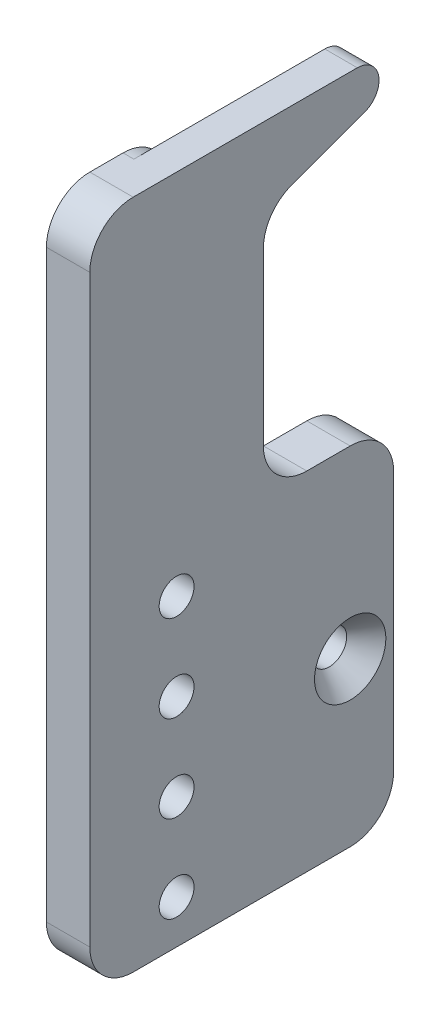
ISO-10303-21;
HEADER;
FILE_DESCRIPTION(('STEP AP214'),'2;1');
FILE_NAME('part.step','',(''),(''),'','','');
FILE_SCHEMA(('AUTOMOTIVE_DESIGN { 1 0 10303 214 1 1 1 1 }'));
ENDSEC;
DATA;
#1=APPLICATION_CONTEXT('core data for automotive mechanical design processes');
#2=APPLICATION_PROTOCOL_DEFINITION('international standard','automotive_design',2000,#1);
#3=PRODUCT_CONTEXT('',#1,'mechanical');
#4=PRODUCT('Part','Part','',(#3));
#5=PRODUCT_RELATED_PRODUCT_CATEGORY('part','',(#4));
#6=PRODUCT_DEFINITION_FORMATION('','',#4);
#7=PRODUCT_DEFINITION_CONTEXT('part definition',#1,'design');
#8=PRODUCT_DEFINITION('design','',#6,#7);
#9=PRODUCT_DEFINITION_SHAPE('','',#8);
#10=(LENGTH_UNIT() NAMED_UNIT(*) SI_UNIT(.MILLI.,.METRE.));
#11=(NAMED_UNIT(*) PLANE_ANGLE_UNIT() SI_UNIT($,.RADIAN.));
#12=(NAMED_UNIT(*) SI_UNIT($,.STERADIAN.) SOLID_ANGLE_UNIT());
#13=UNCERTAINTY_MEASURE_WITH_UNIT(LENGTH_MEASURE(1.E-05),#10,'distance_accuracy_value','');
#14=(GEOMETRIC_REPRESENTATION_CONTEXT(3) GLOBAL_UNCERTAINTY_ASSIGNED_CONTEXT((#13)) GLOBAL_UNIT_ASSIGNED_CONTEXT((#10,
#11,#12)) REPRESENTATION_CONTEXT('',''));
#15=CARTESIAN_POINT('',(0.,0.,0.));
#16=DIRECTION('',(0.,0.,1.));
#17=DIRECTION('',(1.,0.,0.));
#18=AXIS2_PLACEMENT_3D('',#15,#16,#17);
#19=CARTESIAN_POINT('',(335.75625,2.44620492239523,723.9));
#20=DIRECTION('',(-1.,0.,0.));
#21=DIRECTION('',(0.,-1.,0.));
#22=AXIS2_PLACEMENT_3D('',#19,#20,#21);
#23=CYLINDRICAL_SURFACE('',#22,2.5527);
#24=CARTESIAN_POINT('',(329.40625,2.44620492239523,723.9));
#25=DIRECTION('',(1.,0.,0.));
#26=DIRECTION('',(0.,1.,0.));
#27=AXIS2_PLACEMENT_3D('',#24,#25,#26);
#28=CIRCLE('',#27,2.5527);
#29=CARTESIAN_POINT('',(329.40625,4.99890492239524,723.9));
#30=VERTEX_POINT('',#29);
#31=EDGE_CURVE('E275',#30,#30,#28,.T.);
#32=ORIENTED_EDGE('',*,*,#31,.F.);
#33=EDGE_LOOP('',(#32));
#34=FACE_BOUND('',#33,.T.);
#35=CARTESIAN_POINT('',(332.688217457942,2.44620492239523,723.9));
#36=DIRECTION('',(1.,0.,0.));
#37=DIRECTION('',(0.,1.,0.));
#38=AXIS2_PLACEMENT_3D('',#35,#36,#37);
#39=CIRCLE('',#38,2.5527);
#40=CARTESIAN_POINT('',(332.688217457942,4.99890492239524,723.9));
#41=VERTEX_POINT('',#40);
#42=EDGE_CURVE('E567',#41,#41,#39,.T.);
#43=ORIENTED_EDGE('',*,*,#42,.T.);
#44=EDGE_LOOP('',(#43));
#45=FACE_BOUND('',#44,.T.);
#46=ADVANCED_FACE('F17',(#34,#45),#23,.F.);
#47=CARTESIAN_POINT('',(329.40625,-123.508232409556,552.45));
#48=DIRECTION('',(1.,0.,0.));
#49=DIRECTION('',(0.,1.,0.));
#50=AXIS2_PLACEMENT_3D('',#47,#48,#49);
#51=PLANE('',#50);
#52=CARTESIAN_POINT('',(329.40625,-15.0162950776049,749.3));
#53=DIRECTION('',(1.,0.,0.));
#54=DIRECTION('',(0.,1.,0.));
#55=AXIS2_PLACEMENT_3D('',#52,#53,#54);
#56=CIRCLE('',#55,2.5527);
#57=CARTESIAN_POINT('',(329.40625,-12.4635950776049,749.3));
#58=VERTEX_POINT('',#57);
#59=EDGE_CURVE('E286',#58,#58,#56,.T.);
#60=ORIENTED_EDGE('',*,*,#59,.T.);
#61=EDGE_LOOP('',(#60));
#62=FACE_BOUND('',#61,.T.);
#63=CARTESIAN_POINT('',(329.40625,-2.31629507760492,749.3));
#64=DIRECTION('',(1.,0.,0.));
#65=DIRECTION('',(0.,1.,0.));
#66=AXIS2_PLACEMENT_3D('',#63,#64,#65);
#67=CIRCLE('',#66,2.5527);
#68=CARTESIAN_POINT('',(329.40625,0.236404922395075,749.3));
#69=VERTEX_POINT('',#68);
#70=EDGE_CURVE('E284',#69,#69,#67,.T.);
#71=ORIENTED_EDGE('',*,*,#70,.T.);
#72=EDGE_LOOP('',(#71));
#73=FACE_BOUND('',#72,.T.);
#74=CARTESIAN_POINT('',(329.40625,10.3837049223951,749.3));
#75=DIRECTION('',(1.,0.,0.));
#76=DIRECTION('',(0.,1.,0.));
#77=AXIS2_PLACEMENT_3D('',#74,#75,#76);
#78=CIRCLE('',#77,2.5527);
#79=CARTESIAN_POINT('',(329.40625,12.9364049223951,749.3));
#80=VERTEX_POINT('',#79);
#81=EDGE_CURVE('E281',#80,#80,#78,.T.);
#82=ORIENTED_EDGE('',*,*,#81,.T.);
#83=EDGE_LOOP('',(#82));
#84=FACE_BOUND('',#83,.T.);
#85=CARTESIAN_POINT('',(329.40625,23.0837049223951,749.3));
#86=DIRECTION('',(1.,0.,0.));
#87=DIRECTION('',(0.,1.,0.));
#88=AXIS2_PLACEMENT_3D('',#85,#86,#87);
#89=CIRCLE('',#88,2.5527);
#90=CARTESIAN_POINT('',(329.40625,25.6364049223951,749.3));
#91=VERTEX_POINT('',#90);
#92=EDGE_CURVE('E278',#91,#91,#89,.T.);
#93=ORIENTED_EDGE('',*,*,#92,.T.);
#94=EDGE_LOOP('',(#93));
#95=FACE_BOUND('',#94,.T.);
#96=ORIENTED_EDGE('',*,*,#31,.T.);
#97=EDGE_LOOP('',(#96));
#98=FACE_BOUND('',#97,.T.);
#99=DIRECTION('',(0.,0.707106781186548,0.707106781186548));
#100=VECTOR('',#99,1.);
#101=CARTESIAN_POINT('',(329.40625,71.0555077119113,742.378027468976));
#102=LINE('',#101,#100);
#103=CARTESIAN_POINT('',(329.40625,67.1373521824006,738.459871939466));
#104=VERTEX_POINT('',#103);
#105=CARTESIAN_POINT('',(329.40625,74.9736632414219,746.296182998487));
#106=VERTEX_POINT('',#105);
#107=EDGE_CURVE('E156',#104,#106,#102,.T.);
#108=ORIENTED_EDGE('',*,*,#107,.F.);
#109=CARTESIAN_POINT('',(329.40625,62.6472241218661,742.95));
#110=DIRECTION('',(1.,0.,0.));
#111=DIRECTION('',(0.,1.,0.));
#112=AXIS2_PLACEMENT_3D('',#109,#110,#111);
#113=CIRCLE('',#112,6.35);
#114=CARTESIAN_POINT('',(329.40625,62.6472241218661,736.6));
#115=VERTEX_POINT('',#114);
#116=EDGE_CURVE('E238',#104,#115,#113,.F.);
#117=ORIENTED_EDGE('',*,*,#116,.T.);
#118=DIRECTION('',(0.,1.,0.));
#119=VECTOR('',#118,1.);
#120=CARTESIAN_POINT('',(329.40625,47.3555925826652,736.6));
#121=LINE('',#120,#119);
#122=CARTESIAN_POINT('',(329.40625,35.7837049223951,736.6));
#123=VERTEX_POINT('',#122);
#124=EDGE_CURVE('E258',#123,#115,#121,.T.);
#125=ORIENTED_EDGE('',*,*,#124,.F.);
#126=CARTESIAN_POINT('',(329.40625,35.7837049223951,730.25));
#127=DIRECTION('',(1.,0.,0.));
#128=DIRECTION('',(0.,1.,0.));
#129=AXIS2_PLACEMENT_3D('',#126,#127,#128);
#130=CIRCLE('',#129,6.35);
#131=CARTESIAN_POINT('',(329.40625,29.4337049223951,730.25));
#132=VERTEX_POINT('',#131);
#133=EDGE_CURVE('E199',#123,#132,#130,.T.);
#134=ORIENTED_EDGE('',*,*,#133,.T.);
#135=DIRECTION('',(0.,0.,-1.));
#136=VECTOR('',#135,1.);
#137=CARTESIAN_POINT('',(329.40625,29.4337049223951,552.45));
#138=LINE('',#137,#136);
#139=CARTESIAN_POINT('',(329.40625,29.4337049223951,723.9));
#140=VERTEX_POINT('',#139);
#141=EDGE_CURVE('E269',#132,#140,#138,.T.);
#142=ORIENTED_EDGE('',*,*,#141,.T.);
#143=CARTESIAN_POINT('',(329.40625,23.0837049223951,723.9));
#144=DIRECTION('',(1.,0.,0.));
#145=DIRECTION('',(0.,1.,0.));
#146=AXIS2_PLACEMENT_3D('',#143,#144,#145);
#147=CIRCLE('',#146,6.35);
#148=CARTESIAN_POINT('',(329.40625,23.0837049223951,717.55));
#149=VERTEX_POINT('',#148);
#150=EDGE_CURVE('E225',#140,#149,#147,.F.);
#151=ORIENTED_EDGE('',*,*,#150,.T.);
#152=DIRECTION('',(0.,-1.,0.));
#153=VECTOR('',#152,1.);
#154=CARTESIAN_POINT('',(329.40625,4.03370492239507,717.55));
#155=LINE('',#154,#153);
#156=CARTESIAN_POINT('',(329.40625,-15.0162950776049,717.55));
#157=VERTEX_POINT('',#156);
#158=EDGE_CURVE('E264',#149,#157,#155,.T.);
#159=ORIENTED_EDGE('',*,*,#158,.T.);
#160=CARTESIAN_POINT('',(329.40625,-15.0162950776049,723.9));
#161=DIRECTION('',(1.,0.,0.));
#162=DIRECTION('',(0.,1.,0.));
#163=AXIS2_PLACEMENT_3D('',#160,#161,#162);
#164=CIRCLE('',#163,6.35);
#165=CARTESIAN_POINT('',(329.40625,-21.3662950776049,723.9));
#166=VERTEX_POINT('',#165);
#167=EDGE_CURVE('E215',#157,#166,#164,.F.);
#168=ORIENTED_EDGE('',*,*,#167,.T.);
#169=DIRECTION('',(0.,0.,-1.));
#170=VECTOR('',#169,1.);
#171=CARTESIAN_POINT('',(329.40625,-21.3662950776049,739.775));
#172=LINE('',#171,#170);
#173=CARTESIAN_POINT('',(329.40625,-21.3662950776049,755.65));
#174=VERTEX_POINT('',#173);
#175=EDGE_CURVE('E272',#174,#166,#172,.T.);
#176=ORIENTED_EDGE('',*,*,#175,.F.);
#177=CARTESIAN_POINT('',(329.40625,-15.0162950776049,755.65));
#178=DIRECTION('',(1.,0.,0.));
#179=DIRECTION('',(0.,1.,0.));
#180=AXIS2_PLACEMENT_3D('',#177,#178,#179);
#181=CIRCLE('',#180,6.35);
#182=CARTESIAN_POINT('',(329.40625,-15.0162950776049,762.));
#183=VERTEX_POINT('',#182);
#184=EDGE_CURVE('E206',#174,#183,#181,.F.);
#185=ORIENTED_EDGE('',*,*,#184,.T.);
#186=DIRECTION('',(0.,-1.,0.));
#187=VECTOR('',#186,1.);
#188=CARTESIAN_POINT('',(329.40625,4.03370492239506,762.));
#189=LINE('',#188,#187);
#190=CARTESIAN_POINT('',(329.40625,70.4835351808873,762.));
#191=VERTEX_POINT('',#190);
#192=EDGE_CURVE('E163',#191,#183,#189,.T.);
#193=ORIENTED_EDGE('',*,*,#192,.F.);
#194=CARTESIAN_POINT('',(329.40625,70.4835351808873,755.65));
#195=DIRECTION('',(1.,0.,0.));
#196=DIRECTION('',(0.,1.,0.));
#197=AXIS2_PLACEMENT_3D('',#194,#195,#196);
#198=CIRCLE('',#197,6.35);
#199=CARTESIAN_POINT('',(329.40625,76.8335351808873,755.65));
#200=VERTEX_POINT('',#199);
#201=EDGE_CURVE('E187',#191,#200,#198,.F.);
#202=ORIENTED_EDGE('',*,*,#201,.T.);
#203=DIRECTION('',(0.,0.,1.));
#204=VECTOR('',#203,1.);
#205=CARTESIAN_POINT('',(329.40625,76.8335351808873,733.425));
#206=LINE('',#205,#204);
#207=CARTESIAN_POINT('',(329.40625,76.8335351808873,750.786311059021));
#208=VERTEX_POINT('',#207);
#209=EDGE_CURVE('E262',#208,#200,#206,.T.);
#210=ORIENTED_EDGE('',*,*,#209,.F.);
#211=CARTESIAN_POINT('',(329.40625,70.4835351808873,750.786311059021));
#212=DIRECTION('',(1.,0.,0.));
#213=DIRECTION('',(0.,1.,0.));
#214=AXIS2_PLACEMENT_3D('',#211,#212,#213);
#215=CIRCLE('',#214,6.35);
#216=EDGE_CURVE('E236',#208,#106,#215,.F.);
#217=ORIENTED_EDGE('',*,*,#216,.T.);
#218=EDGE_LOOP('',(#108,#117,#125,#134,#142,#151,#159,#168,#176,#185,#193,#202,#210,#217));
#219=FACE_BOUND('',#218,.T.);
#220=ADVANCED_FACE('F257',(#62,#73,#84,#95,#98,#219),#51,.F.);
#221=CARTESIAN_POINT('',(335.75625,76.8335351808873,733.425));
#222=DIRECTION('',(0.,-1.,0.));
#223=DIRECTION('',(1.,0.,0.));
#224=AXIS2_PLACEMENT_3D('',#221,#222,#223);
#225=PLANE('',#224);
#226=DIRECTION('',(0.,0.,1.));
#227=VECTOR('',#226,1.);
#228=CARTESIAN_POINT('',(330.99375,76.8335351808873,733.425));
#229=LINE('',#228,#227);
#230=CARTESIAN_POINT('',(330.99375,76.8335351808873,722.856319777287));
#231=VERTEX_POINT('',#230);
#232=CARTESIAN_POINT('',(330.99375,76.8335351808873,750.786311059021));
#233=VERTEX_POINT('',#232);
#234=EDGE_CURVE('E32',#231,#233,#229,.T.);
#235=ORIENTED_EDGE('',*,*,#234,.T.);
#236=DIRECTION('',(-1.,0.,0.));
#237=VECTOR('',#236,1.);
#238=CARTESIAN_POINT('',(335.75625,76.8335351808873,750.786311059021));
#239=LINE('',#238,#237);
#240=EDGE_CURVE('E241',#233,#208,#239,.T.);
#241=ORIENTED_EDGE('',*,*,#240,.T.);
#242=ORIENTED_EDGE('',*,*,#209,.T.);
#243=DIRECTION('',(-1.,0.,0.));
#244=VECTOR('',#243,1.);
#245=CARTESIAN_POINT('',(335.75625,76.8335351808873,755.65));
#246=LINE('',#245,#244);
#247=CARTESIAN_POINT('',(335.75625,76.8335351808873,755.65));
#248=VERTEX_POINT('',#247);
#249=EDGE_CURVE('E190',#200,#248,#246,.F.);
#250=ORIENTED_EDGE('',*,*,#249,.T.);
#251=DIRECTION('',(0.,0.,1.));
#252=VECTOR('',#251,1.);
#253=CARTESIAN_POINT('',(335.75625,76.8335351808873,733.425));
#254=LINE('',#253,#252);
#255=CARTESIAN_POINT('',(335.75625,76.8335351808873,722.856319777287));
#256=VERTEX_POINT('',#255);
#257=EDGE_CURVE('E307',#256,#248,#254,.T.);
#258=ORIENTED_EDGE('',*,*,#257,.F.);
#259=DIRECTION('',(-1.,0.,0.));
#260=VECTOR('',#259,1.);
#261=CARTESIAN_POINT('',(335.75625,76.8335351808873,722.856319777287));
#262=LINE('',#261,#260);
#263=EDGE_CURVE('E167',#256,#231,#262,.T.);
#264=ORIENTED_EDGE('',*,*,#263,.T.);
#265=EDGE_LOOP('',(#235,#241,#242,#250,#258,#264));
#266=FACE_BOUND('',#265,.T.);
#267=ADVANCED_FACE('F348',(#266),#225,.F.);
#268=CARTESIAN_POINT('',(335.75625,4.03370492239506,762.));
#269=DIRECTION('',(0.,0.,-1.));
#270=DIRECTION('',(-1.,0.,0.));
#271=AXIS2_PLACEMENT_3D('',#268,#269,#270);
#272=PLANE('',#271);
#273=ORIENTED_EDGE('',*,*,#192,.T.);
#274=DIRECTION('',(-1.,0.,0.));
#275=VECTOR('',#274,1.);
#276=CARTESIAN_POINT('',(335.75625,-15.0162950776049,762.));
#277=LINE('',#276,#275);
#278=CARTESIAN_POINT('',(335.75625,-15.0162950776049,762.));
#279=VERTEX_POINT('',#278);
#280=EDGE_CURVE('E208',#183,#279,#277,.F.);
#281=ORIENTED_EDGE('',*,*,#280,.T.);
#282=DIRECTION('',(0.,-1.,0.));
#283=VECTOR('',#282,1.);
#284=CARTESIAN_POINT('',(335.75625,4.03370492239506,762.));
#285=LINE('',#284,#283);
#286=CARTESIAN_POINT('',(335.75625,70.4835351808873,762.));
#287=VERTEX_POINT('',#286);
#288=EDGE_CURVE('E288',#287,#279,#285,.T.);
#289=ORIENTED_EDGE('',*,*,#288,.F.);
#290=DIRECTION('',(-1.,0.,0.));
#291=VECTOR('',#290,1.);
#292=CARTESIAN_POINT('',(335.75625,70.4835351808873,762.));
#293=LINE('',#292,#291);
#294=EDGE_CURVE('E184',#287,#191,#293,.T.);
#295=ORIENTED_EDGE('',*,*,#294,.T.);
#296=EDGE_LOOP('',(#273,#281,#289,#295));
#297=FACE_BOUND('',#296,.T.);
#298=ADVANCED_FACE('F359',(#297),#272,.F.);
#299=CARTESIAN_POINT('',(335.75625,-21.3662950776049,739.775));
#300=DIRECTION('',(0.,1.,0.));
#301=DIRECTION('',(0.,0.,1.));
#302=AXIS2_PLACEMENT_3D('',#299,#300,#301);
#303=PLANE('',#302);
#304=ORIENTED_EDGE('',*,*,#175,.T.);
#305=DIRECTION('',(-1.,0.,0.));
#306=VECTOR('',#305,1.);
#307=CARTESIAN_POINT('',(335.75625,-21.3662950776049,723.9));
#308=LINE('',#307,#306);
#309=CARTESIAN_POINT('',(335.75625,-21.3662950776049,723.9));
#310=VERTEX_POINT('',#309);
#311=EDGE_CURVE('E217',#166,#310,#308,.F.);
#312=ORIENTED_EDGE('',*,*,#311,.T.);
#313=DIRECTION('',(0.,0.,-1.));
#314=VECTOR('',#313,1.);
#315=CARTESIAN_POINT('',(335.75625,-21.3662950776049,739.775));
#316=LINE('',#315,#314);
#317=CARTESIAN_POINT('',(335.75625,-21.3662950776049,755.65));
#318=VERTEX_POINT('',#317);
#319=EDGE_CURVE('E303',#318,#310,#316,.T.);
#320=ORIENTED_EDGE('',*,*,#319,.F.);
#321=DIRECTION('',(-1.,0.,0.));
#322=VECTOR('',#321,1.);
#323=CARTESIAN_POINT('',(335.75625,-21.3662950776049,755.65));
#324=LINE('',#323,#322);
#325=EDGE_CURVE('E203',#318,#174,#324,.T.);
#326=ORIENTED_EDGE('',*,*,#325,.T.);
#327=EDGE_LOOP('',(#304,#312,#320,#326));
#328=FACE_BOUND('',#327,.T.);
#329=ADVANCED_FACE('F355',(#328),#303,.F.);
#330=CARTESIAN_POINT('',(335.75625,4.03370492239507,717.55));
#331=DIRECTION('',(0.,0.,-1.));
#332=DIRECTION('',(-1.,0.,0.));
#333=AXIS2_PLACEMENT_3D('',#330,#331,#332);
#334=PLANE('',#333);
#335=ORIENTED_EDGE('',*,*,#158,.F.);
#336=DIRECTION('',(-1.,0.,0.));
#337=VECTOR('',#336,1.);
#338=CARTESIAN_POINT('',(335.75625,23.0837049223951,717.55));
#339=LINE('',#338,#337);
#340=CARTESIAN_POINT('',(335.75625,23.0837049223951,717.55));
#341=VERTEX_POINT('',#340);
#342=EDGE_CURVE('E227',#149,#341,#339,.F.);
#343=ORIENTED_EDGE('',*,*,#342,.T.);
#344=DIRECTION('',(0.,-1.,0.));
#345=VECTOR('',#344,1.);
#346=CARTESIAN_POINT('',(335.75625,4.03370492239507,717.55));
#347=LINE('',#346,#345);
#348=CARTESIAN_POINT('',(335.75625,-15.0162950776049,717.55));
#349=VERTEX_POINT('',#348);
#350=EDGE_CURVE('E304',#341,#349,#347,.T.);
#351=ORIENTED_EDGE('',*,*,#350,.T.);
#352=DIRECTION('',(-1.,0.,0.));
#353=VECTOR('',#352,1.);
#354=CARTESIAN_POINT('',(329.40625,-15.0162950776049,717.55));
#355=LINE('',#354,#353);
#356=EDGE_CURVE('E212',#349,#157,#355,.T.);
#357=ORIENTED_EDGE('',*,*,#356,.T.);
#358=EDGE_LOOP('',(#335,#343,#351,#357));
#359=FACE_BOUND('',#358,.T.);
#360=ADVANCED_FACE('F358',(#359),#334,.T.);
#361=CARTESIAN_POINT('',(335.75625,29.4337049223951,552.45));
#362=DIRECTION('',(0.,1.,0.));
#363=DIRECTION('',(-1.,0.,0.));
#364=AXIS2_PLACEMENT_3D('',#361,#362,#363);
#365=PLANE('',#364);
#366=DIRECTION('',(0.,0.,-1.));
#367=VECTOR('',#366,1.);
#368=CARTESIAN_POINT('',(335.75625,29.4337049223951,552.45));
#369=LINE('',#368,#367);
#370=CARTESIAN_POINT('',(335.75625,29.4337049223951,730.25));
#371=VERTEX_POINT('',#370);
#372=CARTESIAN_POINT('',(335.75625,29.4337049223951,723.9));
#373=VERTEX_POINT('',#372);
#374=EDGE_CURVE('E301',#371,#373,#369,.T.);
#375=ORIENTED_EDGE('',*,*,#374,.T.);
#376=DIRECTION('',(-1.,0.,0.));
#377=VECTOR('',#376,1.);
#378=CARTESIAN_POINT('',(335.75625,29.4337049223951,723.9));
#379=LINE('',#378,#377);
#380=EDGE_CURVE('E222',#373,#140,#379,.T.);
#381=ORIENTED_EDGE('',*,*,#380,.T.);
#382=ORIENTED_EDGE('',*,*,#141,.F.);
#383=DIRECTION('',(-1.,0.,0.));
#384=VECTOR('',#383,1.);
#385=CARTESIAN_POINT('',(335.75625,29.4337049223951,730.25));
#386=LINE('',#385,#384);
#387=EDGE_CURVE('E197',#132,#371,#386,.F.);
#388=ORIENTED_EDGE('',*,*,#387,.T.);
#389=EDGE_LOOP('',(#375,#381,#382,#388));
#390=FACE_BOUND('',#389,.T.);
#391=ADVANCED_FACE('F361',(#390),#365,.T.);
#392=CARTESIAN_POINT('',(335.75625,47.3555925826652,736.6));
#393=DIRECTION('',(0.,0.,1.));
#394=DIRECTION('',(1.,0.,0.));
#395=AXIS2_PLACEMENT_3D('',#392,#393,#394);
#396=PLANE('',#395);
#397=ORIENTED_EDGE('',*,*,#124,.T.);
#398=DIRECTION('',(-1.,0.,0.));
#399=VECTOR('',#398,1.);
#400=CARTESIAN_POINT('',(335.75625,62.6472241218661,736.6));
#401=LINE('',#400,#399);
#402=CARTESIAN_POINT('',(330.99375,62.6472241218661,736.6));
#403=VERTEX_POINT('',#402);
#404=EDGE_CURVE('E39',#115,#403,#401,.F.);
#405=ORIENTED_EDGE('',*,*,#404,.T.);
#406=DIRECTION('',(0.,-1.,0.));
#407=VECTOR('',#406,1.);
#408=CARTESIAN_POINT('',(330.99375,47.3555925826652,736.6));
#409=LINE('',#408,#407);
#410=CARTESIAN_POINT('',(330.99375,60.8311623753037,736.6));
#411=VERTEX_POINT('',#410);
#412=EDGE_CURVE('E178',#403,#411,#409,.T.);
#413=ORIENTED_EDGE('',*,*,#412,.T.);
#414=DIRECTION('',(-1.,0.,0.));
#415=VECTOR('',#414,1.);
#416=CARTESIAN_POINT('',(335.75625,60.8311623753037,736.6));
#417=LINE('',#416,#415);
#418=CARTESIAN_POINT('',(335.75625,60.8311623753037,736.6));
#419=VERTEX_POINT('',#418);
#420=EDGE_CURVE('E175',#411,#419,#417,.F.);
#421=ORIENTED_EDGE('',*,*,#420,.T.);
#422=DIRECTION('',(0.,1.,0.));
#423=VECTOR('',#422,1.);
#424=CARTESIAN_POINT('',(335.75625,47.3555925826652,736.6));
#425=LINE('',#424,#423);
#426=CARTESIAN_POINT('',(335.75625,35.7837049223951,736.6));
#427=VERTEX_POINT('',#426);
#428=EDGE_CURVE('E292',#427,#419,#425,.T.);
#429=ORIENTED_EDGE('',*,*,#428,.F.);
#430=DIRECTION('',(-1.,0.,0.));
#431=VECTOR('',#430,1.);
#432=CARTESIAN_POINT('',(335.75625,35.7837049223951,736.6));
#433=LINE('',#432,#431);
#434=EDGE_CURVE('E194',#427,#123,#433,.T.);
#435=ORIENTED_EDGE('',*,*,#434,.T.);
#436=EDGE_LOOP('',(#397,#405,#413,#421,#429,#435));
#437=FACE_BOUND('',#436,.T.);
#438=ADVANCED_FACE('F259',(#437),#396,.F.);
#439=CARTESIAN_POINT('',(335.75625,-2.31629507760493,749.3));
#440=DIRECTION('',(-1.,0.,0.));
#441=DIRECTION('',(0.,-1.,0.));
#442=AXIS2_PLACEMENT_3D('',#439,#440,#441);
#443=CYLINDRICAL_SURFACE('',#442,2.5527);
#444=CARTESIAN_POINT('',(335.75625,-2.31629507760493,749.3));
#445=DIRECTION('',(1.,0.,0.));
#446=DIRECTION('',(0.,1.,0.));
#447=AXIS2_PLACEMENT_3D('',#444,#445,#446);
#448=CIRCLE('',#447,2.5527);
#449=CARTESIAN_POINT('',(335.75625,0.23640492239507,749.3));
#450=VERTEX_POINT('',#449);
#451=EDGE_CURVE('E319',#450,#450,#448,.T.);
#452=ORIENTED_EDGE('',*,*,#451,.T.);
#453=EDGE_LOOP('',(#452));
#454=FACE_BOUND('',#453,.T.);
#455=ORIENTED_EDGE('',*,*,#70,.F.);
#456=EDGE_LOOP('',(#455));
#457=FACE_BOUND('',#456,.T.);
#458=ADVANCED_FACE('F374',(#454,#457),#443,.F.);
#459=CARTESIAN_POINT('',(335.75625,10.3837049223951,749.3));
#460=DIRECTION('',(-1.,0.,0.));
#461=DIRECTION('',(0.,-1.,0.));
#462=AXIS2_PLACEMENT_3D('',#459,#460,#461);
#463=CYLINDRICAL_SURFACE('',#462,2.5527);
#464=CARTESIAN_POINT('',(335.75625,10.3837049223951,749.3));
#465=DIRECTION('',(1.,0.,0.));
#466=DIRECTION('',(0.,1.,0.));
#467=AXIS2_PLACEMENT_3D('',#464,#465,#466);
#468=CIRCLE('',#467,2.5527);
#469=CARTESIAN_POINT('',(335.75625,12.9364049223951,749.3));
#470=VERTEX_POINT('',#469);
#471=EDGE_CURVE('E316',#470,#470,#468,.T.);
#472=ORIENTED_EDGE('',*,*,#471,.T.);
#473=EDGE_LOOP('',(#472));
#474=FACE_BOUND('',#473,.T.);
#475=ORIENTED_EDGE('',*,*,#81,.F.);
#476=EDGE_LOOP('',(#475));
#477=FACE_BOUND('',#476,.T.);
#478=ADVANCED_FACE('F448',(#474,#477),#463,.F.);
#479=CARTESIAN_POINT('',(335.75625,23.0837049223951,749.3));
#480=DIRECTION('',(-1.,0.,0.));
#481=DIRECTION('',(0.,-1.,0.));
#482=AXIS2_PLACEMENT_3D('',#479,#480,#481);
#483=CYLINDRICAL_SURFACE('',#482,2.5527);
#484=CARTESIAN_POINT('',(335.75625,23.0837049223951,749.3));
#485=DIRECTION('',(1.,0.,0.));
#486=DIRECTION('',(0.,1.,0.));
#487=AXIS2_PLACEMENT_3D('',#484,#485,#486);
#488=CIRCLE('',#487,2.5527);
#489=CARTESIAN_POINT('',(335.75625,25.6364049223951,749.3));
#490=VERTEX_POINT('',#489);
#491=EDGE_CURVE('E313',#490,#490,#488,.T.);
#492=ORIENTED_EDGE('',*,*,#491,.T.);
#493=EDGE_LOOP('',(#492));
#494=FACE_BOUND('',#493,.T.);
#495=ORIENTED_EDGE('',*,*,#92,.F.);
#496=EDGE_LOOP('',(#495));
#497=FACE_BOUND('',#496,.T.);
#498=ADVANCED_FACE('F353',(#494,#497),#483,.F.);
#499=CARTESIAN_POINT('',(335.75625,71.0555077119114,720.725));
#500=DIRECTION('',(0.,0.939692620785908,0.342020143325669));
#501=DIRECTION('',(0.,-0.342020143325669,0.939692620785908));
#502=AXIS2_PLACEMENT_3D('',#499,#500,#501);
#503=PLANE('',#502);
#504=DIRECTION('',(0.,0.342020143325669,-0.939692620785908));
#505=VECTOR('',#504,1.);
#506=CARTESIAN_POINT('',(335.75625,71.0555077119114,720.725));
#507=LINE('',#506,#505);
#508=CARTESIAN_POINT('',(335.75625,66.7982105172943,732.421827910118));
#509=VERTEX_POINT('',#508);
#510=CARTESIAN_POINT('',(335.75625,70.6750111098921,721.770405822228));
#511=VERTEX_POINT('',#510);
#512=EDGE_CURVE('E297',#509,#511,#507,.T.);
#513=ORIENTED_EDGE('',*,*,#512,.F.);
#514=DIRECTION('',(-1.,0.,0.));
#515=VECTOR('',#514,1.);
#516=CARTESIAN_POINT('',(330.99375,66.7982105172943,732.421827910118));
#517=LINE('',#516,#515);
#518=CARTESIAN_POINT('',(330.99375,66.7982105172943,732.421827910118));
#519=VERTEX_POINT('',#518);
#520=EDGE_CURVE('E152',#509,#519,#517,.T.);
#521=ORIENTED_EDGE('',*,*,#520,.T.);
#522=DIRECTION('',(0.,0.342020143325669,-0.939692620785908));
#523=VECTOR('',#522,1.);
#524=CARTESIAN_POINT('',(330.99375,71.0555077119114,720.725));
#525=LINE('',#524,#523);
#526=CARTESIAN_POINT('',(330.99375,70.6750111098921,721.770405822228));
#527=VERTEX_POINT('',#526);
#528=EDGE_CURVE('E144',#519,#527,#525,.T.);
#529=ORIENTED_EDGE('',*,*,#528,.T.);
#530=DIRECTION('',(-1.,0.,0.));
#531=VECTOR('',#530,1.);
#532=CARTESIAN_POINT('',(335.75625,70.6750111098921,721.770405822228));
#533=LINE('',#532,#531);
#534=EDGE_CURVE('E149',#527,#511,#533,.F.);
#535=ORIENTED_EDGE('',*,*,#534,.T.);
#536=EDGE_LOOP('',(#513,#521,#529,#535));
#537=FACE_BOUND('',#536,.T.);
#538=ADVANCED_FACE('F147',(#537),#503,.F.);
#539=CARTESIAN_POINT('',(335.75625,-15.0162950776049,749.3));
#540=DIRECTION('',(-1.,0.,0.));
#541=DIRECTION('',(0.,-1.,0.));
#542=AXIS2_PLACEMENT_3D('',#539,#540,#541);
#543=CYLINDRICAL_SURFACE('',#542,2.5527);
#544=CARTESIAN_POINT('',(335.75625,-15.0162950776049,749.3));
#545=DIRECTION('',(1.,0.,0.));
#546=DIRECTION('',(0.,1.,0.));
#547=AXIS2_PLACEMENT_3D('',#544,#545,#546);
#548=CIRCLE('',#547,2.5527);
#549=CARTESIAN_POINT('',(335.75625,-12.4635950776049,749.3));
#550=VERTEX_POINT('',#549);
#551=EDGE_CURVE('E170',#550,#550,#548,.T.);
#552=ORIENTED_EDGE('',*,*,#551,.T.);
#553=EDGE_LOOP('',(#552));
#554=FACE_BOUND('',#553,.T.);
#555=ORIENTED_EDGE('',*,*,#59,.F.);
#556=EDGE_LOOP('',(#555));
#557=FACE_BOUND('',#556,.T.);
#558=ADVANCED_FACE('F325',(#554,#557),#543,.F.);
#559=CARTESIAN_POINT('',(335.75625,-123.508232409556,552.45));
#560=DIRECTION('',(1.,0.,0.));
#561=DIRECTION('',(0.,1.,0.));
#562=AXIS2_PLACEMENT_3D('',#559,#560,#561);
#563=PLANE('',#562);
#564=CARTESIAN_POINT('',(335.75625,2.44620492239523,723.9));
#565=DIRECTION('',(-1.,0.,0.));
#566=DIRECTION('',(0.,-1.,0.));
#567=AXIS2_PLACEMENT_3D('',#564,#565,#566);
#568=CIRCLE('',#567,5.2197);
#569=CARTESIAN_POINT('',(335.75625,-2.77349507760476,723.9));
#570=VERTEX_POINT('',#569);
#571=EDGE_CURVE('E569',#570,#570,#568,.T.);
#572=ORIENTED_EDGE('',*,*,#571,.T.);
#573=EDGE_LOOP('',(#572));
#574=FACE_BOUND('',#573,.T.);
#575=ORIENTED_EDGE('',*,*,#350,.F.);
#576=CARTESIAN_POINT('',(335.75625,23.0837049223951,723.9));
#577=DIRECTION('',(1.,0.,0.));
#578=DIRECTION('',(0.,1.,0.));
#579=AXIS2_PLACEMENT_3D('',#576,#577,#578);
#580=CIRCLE('',#579,6.35);
#581=EDGE_CURVE('E229',#341,#373,#580,.T.);
#582=ORIENTED_EDGE('',*,*,#581,.T.);
#583=ORIENTED_EDGE('',*,*,#374,.F.);
#584=CARTESIAN_POINT('',(335.75625,35.7837049223951,730.25));
#585=DIRECTION('',(1.,0.,0.));
#586=DIRECTION('',(0.,1.,0.));
#587=AXIS2_PLACEMENT_3D('',#584,#585,#586);
#588=CIRCLE('',#587,6.35);
#589=EDGE_CURVE('E201',#371,#427,#588,.F.);
#590=ORIENTED_EDGE('',*,*,#589,.T.);
#591=ORIENTED_EDGE('',*,*,#428,.T.);
#592=CARTESIAN_POINT('',(335.75625,60.8311623753037,730.25));
#593=DIRECTION('',(1.,0.,0.));
#594=DIRECTION('',(0.,1.,0.));
#595=AXIS2_PLACEMENT_3D('',#592,#593,#594);
#596=CIRCLE('',#595,6.35);
#597=EDGE_CURVE('E182',#419,#509,#596,.F.);
#598=ORIENTED_EDGE('',*,*,#597,.T.);
#599=ORIENTED_EDGE('',*,*,#512,.T.);
#600=CARTESIAN_POINT('',(335.75625,73.6585351808873,722.856319777287));
#601=DIRECTION('',(1.,0.,0.));
#602=DIRECTION('',(0.,1.,0.));
#603=AXIS2_PLACEMENT_3D('',#600,#601,#602);
#604=CIRCLE('',#603,3.175);
#605=EDGE_CURVE('E166',#511,#256,#604,.T.);
#606=ORIENTED_EDGE('',*,*,#605,.T.);
#607=ORIENTED_EDGE('',*,*,#257,.T.);
#608=CARTESIAN_POINT('',(335.75625,70.4835351808873,755.65));
#609=DIRECTION('',(1.,0.,0.));
#610=DIRECTION('',(0.,1.,0.));
#611=AXIS2_PLACEMENT_3D('',#608,#609,#610);
#612=CIRCLE('',#611,6.35);
#613=EDGE_CURVE('E192',#248,#287,#612,.T.);
#614=ORIENTED_EDGE('',*,*,#613,.T.);
#615=ORIENTED_EDGE('',*,*,#288,.T.);
#616=CARTESIAN_POINT('',(335.75625,-15.0162950776049,755.65));
#617=DIRECTION('',(1.,0.,0.));
#618=DIRECTION('',(0.,1.,0.));
#619=AXIS2_PLACEMENT_3D('',#616,#617,#618);
#620=CIRCLE('',#619,6.35);
#621=EDGE_CURVE('E210',#279,#318,#620,.T.);
#622=ORIENTED_EDGE('',*,*,#621,.T.);
#623=ORIENTED_EDGE('',*,*,#319,.T.);
#624=CARTESIAN_POINT('',(335.75625,-15.0162950776049,723.9));
#625=DIRECTION('',(1.,0.,0.));
#626=DIRECTION('',(0.,1.,0.));
#627=AXIS2_PLACEMENT_3D('',#624,#625,#626);
#628=CIRCLE('',#627,6.35);
#629=EDGE_CURVE('E219',#310,#349,#628,.T.);
#630=ORIENTED_EDGE('',*,*,#629,.T.);
#631=EDGE_LOOP('',(#575,#582,#583,#590,#591,#598,#599,#606,#607,#614,#615,#622,#623,#630));
#632=FACE_BOUND('',#631,.T.);
#633=ORIENTED_EDGE('',*,*,#491,.F.);
#634=EDGE_LOOP('',(#633));
#635=FACE_BOUND('',#634,.T.);
#636=ORIENTED_EDGE('',*,*,#471,.F.);
#637=EDGE_LOOP('',(#636));
#638=FACE_BOUND('',#637,.T.);
#639=ORIENTED_EDGE('',*,*,#451,.F.);
#640=EDGE_LOOP('',(#639));
#641=FACE_BOUND('',#640,.T.);
#642=ORIENTED_EDGE('',*,*,#551,.F.);
#643=EDGE_LOOP('',(#642));
#644=FACE_BOUND('',#643,.T.);
#645=ADVANCED_FACE('F328',(#574,#632,#635,#638,#641,#644),#563,.T.);
#646=CARTESIAN_POINT('',(335.75625,73.6585351808873,722.856319777287));
#647=DIRECTION('',(-1.,0.,0.));
#648=DIRECTION('',(0.,-1.,0.));
#649=AXIS2_PLACEMENT_3D('',#646,#647,#648);
#650=CYLINDRICAL_SURFACE('',#649,3.175);
#651=CARTESIAN_POINT('',(330.99375,73.6585351808873,722.856319777287));
#652=DIRECTION('',(1.,0.,0.));
#653=DIRECTION('',(0.,1.,0.));
#654=AXIS2_PLACEMENT_3D('',#651,#652,#653);
#655=CIRCLE('',#654,3.175);
#656=EDGE_CURVE('E159',#231,#527,#655,.F.);
#657=ORIENTED_EDGE('',*,*,#656,.F.);
#658=ORIENTED_EDGE('',*,*,#263,.F.);
#659=ORIENTED_EDGE('',*,*,#605,.F.);
#660=ORIENTED_EDGE('',*,*,#534,.F.);
#661=EDGE_LOOP('',(#657,#658,#659,#660));
#662=FACE_BOUND('',#661,.T.);
#663=ADVANCED_FACE('F165',(#662),#650,.T.);
#664=CARTESIAN_POINT('',(330.99375,71.0555077119113,742.378027468976));
#665=DIRECTION('',(0.,-0.707106781186548,0.707106781186548));
#666=DIRECTION('',(0.,-0.707106781186548,-0.707106781186548));
#667=AXIS2_PLACEMENT_3D('',#664,#665,#666);
#668=PLANE('',#667);
#669=DIRECTION('',(0.,0.707106781186548,0.707106781186548));
#670=VECTOR('',#669,1.);
#671=CARTESIAN_POINT('',(330.99375,71.0555077119113,742.378027468976));
#672=LINE('',#671,#670);
#673=CARTESIAN_POINT('',(330.99375,67.1373521824006,738.459871939466));
#674=VERTEX_POINT('',#673);
#675=CARTESIAN_POINT('',(330.99375,74.9736632414219,746.296182998487));
#676=VERTEX_POINT('',#675);
#677=EDGE_CURVE('E155',#674,#676,#672,.T.);
#678=ORIENTED_EDGE('',*,*,#677,.F.);
#679=DIRECTION('',(-1.,0.,0.));
#680=VECTOR('',#679,1.);
#681=CARTESIAN_POINT('',(330.99375,67.1373521824007,738.459871939466));
#682=LINE('',#681,#680);
#683=EDGE_CURVE('E233',#674,#104,#682,.T.);
#684=ORIENTED_EDGE('',*,*,#683,.T.);
#685=ORIENTED_EDGE('',*,*,#107,.T.);
#686=DIRECTION('',(-1.,0.,0.));
#687=VECTOR('',#686,1.);
#688=CARTESIAN_POINT('',(330.99375,74.9736632414219,746.296182998487));
#689=LINE('',#688,#687);
#690=EDGE_CURVE('E231',#106,#676,#689,.F.);
#691=ORIENTED_EDGE('',*,*,#690,.T.);
#692=EDGE_LOOP('',(#678,#684,#685,#691));
#693=FACE_BOUND('',#692,.T.);
#694=ADVANCED_FACE('F249',(#693),#668,.F.);
#695=CARTESIAN_POINT('',(330.99375,27.7336200516412,739.775));
#696=DIRECTION('',(-1.,0.,0.));
#697=DIRECTION('',(0.,-1.,0.));
#698=AXIS2_PLACEMENT_3D('',#695,#696,#697);
#699=PLANE('',#698);
#700=ORIENTED_EDGE('',*,*,#528,.F.);
#701=CARTESIAN_POINT('',(330.99375,60.8311623753037,730.25));
#702=DIRECTION('',(-1.,0.,0.));
#703=DIRECTION('',(0.,-1.,0.));
#704=AXIS2_PLACEMENT_3D('',#701,#702,#703);
#705=CIRCLE('',#704,6.35);
#706=EDGE_CURVE('E180',#519,#411,#705,.F.);
#707=ORIENTED_EDGE('',*,*,#706,.T.);
#708=ORIENTED_EDGE('',*,*,#412,.F.);
#709=CARTESIAN_POINT('',(330.99375,62.6472241218661,742.95));
#710=DIRECTION('',(-1.,0.,0.));
#711=DIRECTION('',(0.,-1.,0.));
#712=AXIS2_PLACEMENT_3D('',#709,#710,#711);
#713=CIRCLE('',#712,6.35);
#714=EDGE_CURVE('E25',#403,#674,#713,.F.);
#715=ORIENTED_EDGE('',*,*,#714,.T.);
#716=ORIENTED_EDGE('',*,*,#677,.T.);
#717=CARTESIAN_POINT('',(330.99375,70.4835351808873,750.786311059021));
#718=DIRECTION('',(-1.,0.,0.));
#719=DIRECTION('',(0.,-1.,0.));
#720=AXIS2_PLACEMENT_3D('',#717,#718,#719);
#721=CIRCLE('',#720,6.35);
#722=EDGE_CURVE('E11',#676,#233,#721,.F.);
#723=ORIENTED_EDGE('',*,*,#722,.T.);
#724=ORIENTED_EDGE('',*,*,#234,.F.);
#725=ORIENTED_EDGE('',*,*,#656,.T.);
#726=EDGE_LOOP('',(#700,#707,#708,#715,#716,#723,#724,#725));
#727=FACE_BOUND('',#726,.T.);
#728=ADVANCED_FACE('F160',(#727),#699,.T.);
#729=CARTESIAN_POINT('',(335.75625,60.8311623753037,730.25));
#730=DIRECTION('',(1.,0.,0.));
#731=DIRECTION('',(0.,1.,0.));
#732=AXIS2_PLACEMENT_3D('',#729,#730,#731);
#733=CYLINDRICAL_SURFACE('',#732,6.35);
#734=ORIENTED_EDGE('',*,*,#597,.F.);
#735=ORIENTED_EDGE('',*,*,#420,.F.);
#736=ORIENTED_EDGE('',*,*,#706,.F.);
#737=ORIENTED_EDGE('',*,*,#520,.F.);
#738=EDGE_LOOP('',(#734,#735,#736,#737));
#739=FACE_BOUND('',#738,.T.);
#740=ADVANCED_FACE('F378',(#739),#733,.F.);
#741=CARTESIAN_POINT('',(335.75625,70.4835351808873,755.65));
#742=DIRECTION('',(-1.,0.,0.));
#743=DIRECTION('',(0.,-1.,0.));
#744=AXIS2_PLACEMENT_3D('',#741,#742,#743);
#745=CYLINDRICAL_SURFACE('',#744,6.35);
#746=ORIENTED_EDGE('',*,*,#613,.F.);
#747=ORIENTED_EDGE('',*,*,#249,.F.);
#748=ORIENTED_EDGE('',*,*,#201,.F.);
#749=ORIENTED_EDGE('',*,*,#294,.F.);
#750=EDGE_LOOP('',(#746,#747,#748,#749));
#751=FACE_BOUND('',#750,.T.);
#752=ADVANCED_FACE('F381',(#751),#745,.T.);
#753=CARTESIAN_POINT('',(335.75625,35.7837049223951,730.25));
#754=DIRECTION('',(-1.,0.,0.));
#755=DIRECTION('',(0.,-1.,0.));
#756=AXIS2_PLACEMENT_3D('',#753,#754,#755);
#757=CYLINDRICAL_SURFACE('',#756,6.35);
#758=ORIENTED_EDGE('',*,*,#589,.F.);
#759=ORIENTED_EDGE('',*,*,#387,.F.);
#760=ORIENTED_EDGE('',*,*,#133,.F.);
#761=ORIENTED_EDGE('',*,*,#434,.F.);
#762=EDGE_LOOP('',(#758,#759,#760,#761));
#763=FACE_BOUND('',#762,.T.);
#764=ADVANCED_FACE('F385',(#763),#757,.F.);
#765=CARTESIAN_POINT('',(335.75625,-15.0162950776049,755.65));
#766=DIRECTION('',(-1.,0.,0.));
#767=DIRECTION('',(0.,-1.,0.));
#768=AXIS2_PLACEMENT_3D('',#765,#766,#767);
#769=CYLINDRICAL_SURFACE('',#768,6.35);
#770=ORIENTED_EDGE('',*,*,#621,.F.);
#771=ORIENTED_EDGE('',*,*,#280,.F.);
#772=ORIENTED_EDGE('',*,*,#184,.F.);
#773=ORIENTED_EDGE('',*,*,#325,.F.);
#774=EDGE_LOOP('',(#770,#771,#772,#773));
#775=FACE_BOUND('',#774,.T.);
#776=ADVANCED_FACE('F389',(#775),#769,.T.);
#777=CARTESIAN_POINT('',(335.75625,-15.0162950776049,723.9));
#778=DIRECTION('',(1.,0.,0.));
#779=DIRECTION('',(0.,1.,0.));
#780=AXIS2_PLACEMENT_3D('',#777,#778,#779);
#781=CYLINDRICAL_SURFACE('',#780,6.35);
#782=ORIENTED_EDGE('',*,*,#629,.F.);
#783=ORIENTED_EDGE('',*,*,#311,.F.);
#784=ORIENTED_EDGE('',*,*,#167,.F.);
#785=ORIENTED_EDGE('',*,*,#356,.F.);
#786=EDGE_LOOP('',(#782,#783,#784,#785));
#787=FACE_BOUND('',#786,.T.);
#788=ADVANCED_FACE('F393',(#787),#781,.T.);
#789=CARTESIAN_POINT('',(335.75625,23.0837049223951,723.9));
#790=DIRECTION('',(-1.,0.,0.));
#791=DIRECTION('',(0.,-1.,0.));
#792=AXIS2_PLACEMENT_3D('',#789,#790,#791);
#793=CYLINDRICAL_SURFACE('',#792,6.35);
#794=ORIENTED_EDGE('',*,*,#581,.F.);
#795=ORIENTED_EDGE('',*,*,#342,.F.);
#796=ORIENTED_EDGE('',*,*,#150,.F.);
#797=ORIENTED_EDGE('',*,*,#380,.F.);
#798=EDGE_LOOP('',(#794,#795,#796,#797));
#799=FACE_BOUND('',#798,.T.);
#800=ADVANCED_FACE('F397',(#799),#793,.T.);
#801=CARTESIAN_POINT('',(330.99375,62.6472241218661,742.95));
#802=DIRECTION('',(-1.,0.,0.));
#803=DIRECTION('',(0.,-1.,0.));
#804=AXIS2_PLACEMENT_3D('',#801,#802,#803);
#805=CYLINDRICAL_SURFACE('',#804,6.35);
#806=ORIENTED_EDGE('',*,*,#714,.F.);
#807=ORIENTED_EDGE('',*,*,#404,.F.);
#808=ORIENTED_EDGE('',*,*,#116,.F.);
#809=ORIENTED_EDGE('',*,*,#683,.F.);
#810=EDGE_LOOP('',(#806,#807,#808,#809));
#811=FACE_BOUND('',#810,.T.);
#812=ADVANCED_FACE('F254',(#811),#805,.T.);
#813=CARTESIAN_POINT('',(335.75625,70.4835351808873,750.786311059021));
#814=DIRECTION('',(-1.,0.,0.));
#815=DIRECTION('',(0.,-1.,0.));
#816=AXIS2_PLACEMENT_3D('',#813,#814,#815);
#817=CYLINDRICAL_SURFACE('',#816,6.35);
#818=ORIENTED_EDGE('',*,*,#722,.F.);
#819=ORIENTED_EDGE('',*,*,#690,.F.);
#820=ORIENTED_EDGE('',*,*,#216,.F.);
#821=ORIENTED_EDGE('',*,*,#240,.F.);
#822=EDGE_LOOP('',(#818,#819,#820,#821));
#823=FACE_BOUND('',#822,.T.);
#824=ADVANCED_FACE('F19',(#823),#817,.T.);
#825=CARTESIAN_POINT('',(335.75625,2.44620492239523,723.9));
#826=DIRECTION('',(1.,0.,0.));
#827=DIRECTION('',(0.,1.,0.));
#828=AXIS2_PLACEMENT_3D('',#825,#826,#827);
#829=CONICAL_SURFACE('',#828,5.2197,0.715584993317674);
#830=ORIENTED_EDGE('',*,*,#42,.F.);
#831=EDGE_LOOP('',(#830));
#832=FACE_BOUND('',#831,.T.);
#833=ORIENTED_EDGE('',*,*,#571,.F.);
#834=EDGE_LOOP('',(#833));
#835=FACE_BOUND('',#834,.T.);
#836=ADVANCED_FACE('F405',(#832,#835),#829,.F.);
#837=CLOSED_SHELL('',(#46,#220,#267,#298,#329,#360,#391,#438,#458,#478,#498,#538,#558,#645,#663,
#694,#728,#740,#752,#764,#776,#788,#800,#812,#824,#836));
#838=MANIFOLD_SOLID_BREP('B1',#837);
#839=ADVANCED_BREP_SHAPE_REPRESENTATION('',(#18,#838),#14);
#840=SHAPE_DEFINITION_REPRESENTATION(#9,#839);
ENDSEC;
END-ISO-10303-21;
